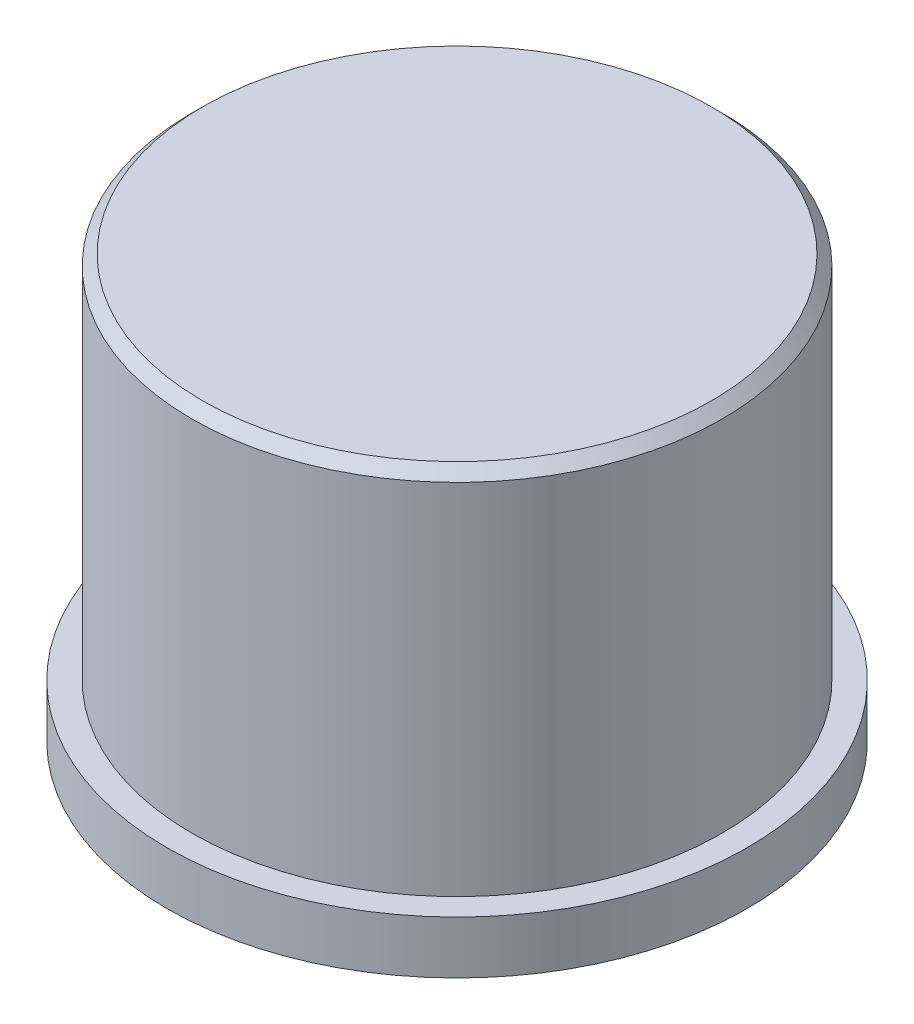
ISO-10303-21;
HEADER;
FILE_DESCRIPTION(('STEP AP214'),'2;1');
FILE_NAME('part.step','',(''),(''),'','','');
FILE_SCHEMA(('AUTOMOTIVE_DESIGN { 1 0 10303 214 1 1 1 1 }'));
ENDSEC;
DATA;
#1=APPLICATION_CONTEXT('core data for automotive mechanical design processes');
#2=APPLICATION_PROTOCOL_DEFINITION('international standard','automotive_design',2000,#1);
#3=PRODUCT_CONTEXT('',#1,'mechanical');
#4=PRODUCT('Part','Part','',(#3));
#5=PRODUCT_RELATED_PRODUCT_CATEGORY('part','',(#4));
#6=PRODUCT_DEFINITION_FORMATION('','',#4);
#7=PRODUCT_DEFINITION_CONTEXT('part definition',#1,'design');
#8=PRODUCT_DEFINITION('design','',#6,#7);
#9=PRODUCT_DEFINITION_SHAPE('','',#8);
#10=(LENGTH_UNIT() NAMED_UNIT(*) SI_UNIT(.MILLI.,.METRE.));
#11=(NAMED_UNIT(*) PLANE_ANGLE_UNIT() SI_UNIT($,.RADIAN.));
#12=(NAMED_UNIT(*) SI_UNIT($,.STERADIAN.) SOLID_ANGLE_UNIT());
#13=UNCERTAINTY_MEASURE_WITH_UNIT(LENGTH_MEASURE(1.E-05),#10,'distance_accuracy_value','');
#14=(GEOMETRIC_REPRESENTATION_CONTEXT(3) GLOBAL_UNCERTAINTY_ASSIGNED_CONTEXT((#13)) GLOBAL_UNIT_ASSIGNED_CONTEXT((#10,
#11,#12)) REPRESENTATION_CONTEXT('',''));
#15=CARTESIAN_POINT('',(0.,0.,0.));
#16=DIRECTION('',(0.,0.,1.));
#17=DIRECTION('',(1.,0.,0.));
#18=AXIS2_PLACEMENT_3D('',#15,#16,#17);
#19=CARTESIAN_POINT('',(0.,1.,0.));
#20=DIRECTION('',(0.,-1.,0.));
#21=DIRECTION('',(0.,0.,-1.));
#22=AXIS2_PLACEMENT_3D('',#19,#20,#21);
#23=CYLINDRICAL_SURFACE('',#22,5.5);
#24=CARTESIAN_POINT('',(0.,1.,0.));
#25=DIRECTION('',(0.,1.,0.));
#26=DIRECTION('',(0.,0.,1.));
#27=AXIS2_PLACEMENT_3D('',#24,#25,#26);
#28=CIRCLE('',#27,5.5);
#29=CARTESIAN_POINT('',(0.,1.,5.5));
#30=VERTEX_POINT('',#29);
#31=EDGE_CURVE('E155',#30,#30,#28,.T.);
#32=ORIENTED_EDGE('',*,*,#31,.F.);
#33=EDGE_LOOP('',(#32));
#34=FACE_BOUND('',#33,.T.);
#35=CARTESIAN_POINT('',(0.,0.,0.));
#36=DIRECTION('',(0.,1.,0.));
#37=DIRECTION('',(0.,0.,1.));
#38=AXIS2_PLACEMENT_3D('',#35,#36,#37);
#39=CIRCLE('',#38,5.5);
#40=CARTESIAN_POINT('',(0.,0.,5.5));
#41=VERTEX_POINT('',#40);
#42=EDGE_CURVE('E146',#41,#41,#39,.T.);
#43=ORIENTED_EDGE('',*,*,#42,.T.);
#44=EDGE_LOOP('',(#43));
#45=FACE_BOUND('',#44,.T.);
#46=ADVANCED_FACE('F43',(#34,#45),#23,.T.);
#47=CARTESIAN_POINT('',(0.,1.,0.));
#48=DIRECTION('',(0.,1.,0.));
#49=DIRECTION('',(0.,0.,1.));
#50=AXIS2_PLACEMENT_3D('',#47,#48,#49);
#51=PLANE('',#50);
#52=CARTESIAN_POINT('',(0.,1.,0.));
#53=DIRECTION('',(0.,1.,0.));
#54=DIRECTION('',(0.,0.,1.));
#55=AXIS2_PLACEMENT_3D('',#52,#53,#54);
#56=CIRCLE('',#55,5.025);
#57=CARTESIAN_POINT('',(0.,1.,5.025));
#58=VERTEX_POINT('',#57);
#59=EDGE_CURVE('E152',#58,#58,#56,.T.);
#60=ORIENTED_EDGE('',*,*,#59,.F.);
#61=EDGE_LOOP('',(#60));
#62=FACE_BOUND('',#61,.T.);
#63=ORIENTED_EDGE('',*,*,#31,.T.);
#64=EDGE_LOOP('',(#63));
#65=FACE_BOUND('',#64,.T.);
#66=ADVANCED_FACE('F174',(#62,#65),#51,.T.);
#67=CARTESIAN_POINT('',(0.,0.,0.));
#68=DIRECTION('',(0.,1.,0.));
#69=DIRECTION('',(0.,0.,1.));
#70=AXIS2_PLACEMENT_3D('',#67,#68,#69);
#71=PLANE('',#70);
#72=DIRECTION('',(-0.5,0.,0.866025403784439));
#73=VECTOR('',#72,1.);
#74=CARTESIAN_POINT('',(3.00222139978605,0.,0.));
#75=LINE('',#74,#73);
#76=CARTESIAN_POINT('',(3.00222139978605,0.,0.));
#77=VERTEX_POINT('',#76);
#78=CARTESIAN_POINT('',(1.50111069989303,0.,2.6));
#79=VERTEX_POINT('',#78);
#80=EDGE_CURVE('E133',#77,#79,#75,.T.);
#81=ORIENTED_EDGE('',*,*,#80,.F.);
#82=DIRECTION('',(0.499999999999999,0.,0.866025403784439));
#83=VECTOR('',#82,1.);
#84=CARTESIAN_POINT('',(1.50111069989303,0.,-2.6));
#85=LINE('',#84,#83);
#86=CARTESIAN_POINT('',(1.50111069989303,0.,-2.6));
#87=VERTEX_POINT('',#86);
#88=EDGE_CURVE('E59',#87,#77,#85,.T.);
#89=ORIENTED_EDGE('',*,*,#88,.F.);
#90=DIRECTION('',(1.,0.,0.));
#91=VECTOR('',#90,1.);
#92=CARTESIAN_POINT('',(-1.50111069989303,0.,-2.6));
#93=LINE('',#92,#91);
#94=CARTESIAN_POINT('',(-1.50111069989303,0.,-2.6));
#95=VERTEX_POINT('',#94);
#96=EDGE_CURVE('E142',#95,#87,#93,.T.);
#97=ORIENTED_EDGE('',*,*,#96,.F.);
#98=DIRECTION('',(0.5,0.,-0.866025403784438));
#99=VECTOR('',#98,1.);
#100=CARTESIAN_POINT('',(-3.00222139978605,0.,0.));
#101=LINE('',#100,#99);
#102=CARTESIAN_POINT('',(-3.00222139978605,0.,0.));
#103=VERTEX_POINT('',#102);
#104=EDGE_CURVE('E140',#103,#95,#101,.T.);
#105=ORIENTED_EDGE('',*,*,#104,.F.);
#106=DIRECTION('',(-0.5,0.,-0.866025403784439));
#107=VECTOR('',#106,1.);
#108=CARTESIAN_POINT('',(-1.50111069989303,0.,2.6));
#109=LINE('',#108,#107);
#110=CARTESIAN_POINT('',(-1.50111069989303,0.,2.6));
#111=VERTEX_POINT('',#110);
#112=EDGE_CURVE('E107',#111,#103,#109,.T.);
#113=ORIENTED_EDGE('',*,*,#112,.F.);
#114=DIRECTION('',(-1.,0.,0.));
#115=VECTOR('',#114,1.);
#116=CARTESIAN_POINT('',(1.50111069989303,0.,2.6));
#117=LINE('',#116,#115);
#118=EDGE_CURVE('E136',#79,#111,#117,.T.);
#119=ORIENTED_EDGE('',*,*,#118,.F.);
#120=EDGE_LOOP('',(#81,#89,#97,#105,#113,#119));
#121=FACE_BOUND('',#120,.T.);
#122=ORIENTED_EDGE('',*,*,#42,.F.);
#123=EDGE_LOOP('',(#122));
#124=FACE_BOUND('',#123,.T.);
#125=ADVANCED_FACE('F179',(#121,#124),#71,.F.);
#126=CARTESIAN_POINT('',(0.,8.,0.));
#127=DIRECTION('',(0.,-1.,0.));
#128=DIRECTION('',(0.,0.,-1.));
#129=AXIS2_PLACEMENT_3D('',#126,#127,#128);
#130=CYLINDRICAL_SURFACE('',#129,5.025);
#131=CARTESIAN_POINT('',(0.,7.8,0.));
#132=DIRECTION('',(0.,1.,0.));
#133=DIRECTION('',(0.,0.,1.));
#134=AXIS2_PLACEMENT_3D('',#131,#132,#133);
#135=CIRCLE('',#134,5.025);
#136=CARTESIAN_POINT('',(0.,7.8,5.025));
#137=VERTEX_POINT('',#136);
#138=EDGE_CURVE('E11',#137,#137,#135,.F.);
#139=ORIENTED_EDGE('',*,*,#138,.T.);
#140=EDGE_LOOP('',(#139));
#141=FACE_BOUND('',#140,.T.);
#142=ORIENTED_EDGE('',*,*,#59,.T.);
#143=EDGE_LOOP('',(#142));
#144=FACE_BOUND('',#143,.T.);
#145=ADVANCED_FACE('F186',(#141,#144),#130,.T.);
#146=CARTESIAN_POINT('',(0.,8.,0.));
#147=DIRECTION('',(0.,1.,0.));
#148=DIRECTION('',(0.,0.,1.));
#149=AXIS2_PLACEMENT_3D('',#146,#147,#148);
#150=PLANE('',#149);
#151=CARTESIAN_POINT('',(0.,8.,0.));
#152=DIRECTION('',(0.,1.,0.));
#153=DIRECTION('',(0.,0.,1.));
#154=AXIS2_PLACEMENT_3D('',#151,#152,#153);
#155=CIRCLE('',#154,4.825);
#156=CARTESIAN_POINT('',(0.,8.,4.825));
#157=VERTEX_POINT('',#156);
#158=EDGE_CURVE('E52',#157,#157,#155,.T.);
#159=ORIENTED_EDGE('',*,*,#158,.T.);
#160=EDGE_LOOP('',(#159));
#161=FACE_BOUND('',#160,.T.);
#162=ADVANCED_FACE('F162',(#161),#150,.T.);
#163=CARTESIAN_POINT('',(1.50111069989303,7.,-2.6));
#164=DIRECTION('',(0.866025403784439,0.,-0.499999999999999));
#165=DIRECTION('',(-0.499999999999999,0.,-0.866025403784439));
#166=AXIS2_PLACEMENT_3D('',#163,#164,#165);
#167=PLANE('',#166);
#168=ORIENTED_EDGE('',*,*,#88,.T.);
#169=DIRECTION('',(0.,-1.,0.));
#170=VECTOR('',#169,1.);
#171=CARTESIAN_POINT('',(3.00222139978605,7.,0.));
#172=LINE('',#171,#170);
#173=CARTESIAN_POINT('',(3.00222139978605,7.,0.));
#174=VERTEX_POINT('',#173);
#175=EDGE_CURVE('E89',#174,#77,#172,.T.);
#176=ORIENTED_EDGE('',*,*,#175,.F.);
#177=DIRECTION('',(0.499999999999999,0.,0.866025403784439));
#178=VECTOR('',#177,1.);
#179=CARTESIAN_POINT('',(1.50111069989303,7.,-2.6));
#180=LINE('',#179,#178);
#181=CARTESIAN_POINT('',(1.50111069989303,7.,-2.6));
#182=VERTEX_POINT('',#181);
#183=EDGE_CURVE('E144',#182,#174,#180,.T.);
#184=ORIENTED_EDGE('',*,*,#183,.F.);
#185=DIRECTION('',(0.,-1.,0.));
#186=VECTOR('',#185,1.);
#187=CARTESIAN_POINT('',(1.50111069989303,7.,-2.6));
#188=LINE('',#187,#186);
#189=EDGE_CURVE('E67',#182,#87,#188,.T.);
#190=ORIENTED_EDGE('',*,*,#189,.T.);
#191=EDGE_LOOP('',(#168,#176,#184,#190));
#192=FACE_BOUND('',#191,.T.);
#193=ADVANCED_FACE('F193',(#192),#167,.F.);
#194=CARTESIAN_POINT('',(-1.50111069989303,7.,-2.6));
#195=DIRECTION('',(0.,0.,-1.));
#196=DIRECTION('',(-1.,0.,0.));
#197=AXIS2_PLACEMENT_3D('',#194,#195,#196);
#198=PLANE('',#197);
#199=ORIENTED_EDGE('',*,*,#96,.T.);
#200=ORIENTED_EDGE('',*,*,#189,.F.);
#201=DIRECTION('',(1.,0.,0.));
#202=VECTOR('',#201,1.);
#203=CARTESIAN_POINT('',(-1.50111069989303,7.,-2.6));
#204=LINE('',#203,#202);
#205=CARTESIAN_POINT('',(-1.50111069989303,7.,-2.6));
#206=VERTEX_POINT('',#205);
#207=EDGE_CURVE('E119',#206,#182,#204,.T.);
#208=ORIENTED_EDGE('',*,*,#207,.F.);
#209=DIRECTION('',(0.,-1.,0.));
#210=VECTOR('',#209,1.);
#211=CARTESIAN_POINT('',(-1.50111069989303,7.,-2.6));
#212=LINE('',#211,#210);
#213=EDGE_CURVE('E111',#206,#95,#212,.T.);
#214=ORIENTED_EDGE('',*,*,#213,.T.);
#215=EDGE_LOOP('',(#199,#200,#208,#214));
#216=FACE_BOUND('',#215,.T.);
#217=ADVANCED_FACE('F196',(#216),#198,.F.);
#218=CARTESIAN_POINT('',(-3.00222139978605,7.,0.));
#219=DIRECTION('',(-0.866025403784438,0.,-0.5));
#220=DIRECTION('',(-0.5,0.,0.866025403784438));
#221=AXIS2_PLACEMENT_3D('',#218,#219,#220);
#222=PLANE('',#221);
#223=ORIENTED_EDGE('',*,*,#104,.T.);
#224=ORIENTED_EDGE('',*,*,#213,.F.);
#225=DIRECTION('',(0.5,0.,-0.866025403784438));
#226=VECTOR('',#225,1.);
#227=CARTESIAN_POINT('',(-3.00222139978605,7.,0.));
#228=LINE('',#227,#226);
#229=CARTESIAN_POINT('',(-3.00222139978605,7.,0.));
#230=VERTEX_POINT('',#229);
#231=EDGE_CURVE('E115',#230,#206,#228,.T.);
#232=ORIENTED_EDGE('',*,*,#231,.F.);
#233=DIRECTION('',(0.,-1.,0.));
#234=VECTOR('',#233,1.);
#235=CARTESIAN_POINT('',(-3.00222139978605,7.,0.));
#236=LINE('',#235,#234);
#237=EDGE_CURVE('E100',#230,#103,#236,.T.);
#238=ORIENTED_EDGE('',*,*,#237,.T.);
#239=EDGE_LOOP('',(#223,#224,#232,#238));
#240=FACE_BOUND('',#239,.T.);
#241=ADVANCED_FACE('F116',(#240),#222,.F.);
#242=CARTESIAN_POINT('',(-1.50111069989303,7.,2.6));
#243=DIRECTION('',(-0.866025403784439,0.,0.5));
#244=DIRECTION('',(0.5,0.,0.866025403784439));
#245=AXIS2_PLACEMENT_3D('',#242,#243,#244);
#246=PLANE('',#245);
#247=ORIENTED_EDGE('',*,*,#112,.T.);
#248=ORIENTED_EDGE('',*,*,#237,.F.);
#249=DIRECTION('',(-0.5,0.,-0.866025403784439));
#250=VECTOR('',#249,1.);
#251=CARTESIAN_POINT('',(-1.50111069989303,7.,2.6));
#252=LINE('',#251,#250);
#253=CARTESIAN_POINT('',(-1.50111069989303,7.,2.6));
#254=VERTEX_POINT('',#253);
#255=EDGE_CURVE('E104',#254,#230,#252,.T.);
#256=ORIENTED_EDGE('',*,*,#255,.F.);
#257=DIRECTION('',(0.,-1.,0.));
#258=VECTOR('',#257,1.);
#259=CARTESIAN_POINT('',(-1.50111069989303,7.,2.6));
#260=LINE('',#259,#258);
#261=EDGE_CURVE('E112',#254,#111,#260,.T.);
#262=ORIENTED_EDGE('',*,*,#261,.T.);
#263=EDGE_LOOP('',(#247,#248,#256,#262));
#264=FACE_BOUND('',#263,.T.);
#265=ADVANCED_FACE('F102',(#264),#246,.F.);
#266=CARTESIAN_POINT('',(1.50111069989303,7.,2.6));
#267=DIRECTION('',(0.,0.,1.));
#268=DIRECTION('',(1.,0.,0.));
#269=AXIS2_PLACEMENT_3D('',#266,#267,#268);
#270=PLANE('',#269);
#271=ORIENTED_EDGE('',*,*,#118,.T.);
#272=ORIENTED_EDGE('',*,*,#261,.F.);
#273=DIRECTION('',(-1.,0.,0.));
#274=VECTOR('',#273,1.);
#275=CARTESIAN_POINT('',(1.50111069989303,7.,2.6));
#276=LINE('',#275,#274);
#277=CARTESIAN_POINT('',(1.50111069989303,7.,2.6));
#278=VERTEX_POINT('',#277);
#279=EDGE_CURVE('E125',#278,#254,#276,.T.);
#280=ORIENTED_EDGE('',*,*,#279,.F.);
#281=DIRECTION('',(0.,-1.,0.));
#282=VECTOR('',#281,1.);
#283=CARTESIAN_POINT('',(1.50111069989303,7.,2.6));
#284=LINE('',#283,#282);
#285=EDGE_CURVE('E149',#278,#79,#284,.T.);
#286=ORIENTED_EDGE('',*,*,#285,.T.);
#287=EDGE_LOOP('',(#271,#272,#280,#286));
#288=FACE_BOUND('',#287,.T.);
#289=ADVANCED_FACE('F199',(#288),#270,.F.);
#290=CARTESIAN_POINT('',(3.00222139978605,7.,0.));
#291=DIRECTION('',(0.866025403784439,0.,0.5));
#292=DIRECTION('',(0.5,0.,-0.866025403784439));
#293=AXIS2_PLACEMENT_3D('',#290,#291,#292);
#294=PLANE('',#293);
#295=ORIENTED_EDGE('',*,*,#80,.T.);
#296=ORIENTED_EDGE('',*,*,#285,.F.);
#297=DIRECTION('',(-0.5,0.,0.866025403784439));
#298=VECTOR('',#297,1.);
#299=CARTESIAN_POINT('',(3.00222139978605,7.,0.));
#300=LINE('',#299,#298);
#301=EDGE_CURVE('E127',#174,#278,#300,.T.);
#302=ORIENTED_EDGE('',*,*,#301,.F.);
#303=ORIENTED_EDGE('',*,*,#175,.T.);
#304=EDGE_LOOP('',(#295,#296,#302,#303));
#305=FACE_BOUND('',#304,.T.);
#306=ADVANCED_FACE('F170',(#305),#294,.F.);
#307=CARTESIAN_POINT('',(0.,7.,0.));
#308=DIRECTION('',(0.,-1.,0.));
#309=DIRECTION('',(0.,0.,-1.));
#310=AXIS2_PLACEMENT_3D('',#307,#308,#309);
#311=PLANE('',#310);
#312=ORIENTED_EDGE('',*,*,#183,.T.);
#313=ORIENTED_EDGE('',*,*,#301,.T.);
#314=ORIENTED_EDGE('',*,*,#279,.T.);
#315=ORIENTED_EDGE('',*,*,#255,.T.);
#316=ORIENTED_EDGE('',*,*,#231,.T.);
#317=ORIENTED_EDGE('',*,*,#207,.T.);
#318=EDGE_LOOP('',(#312,#313,#314,#315,#316,#317));
#319=FACE_BOUND('',#318,.T.);
#320=ADVANCED_FACE('F122',(#319),#311,.T.);
#321=CARTESIAN_POINT('',(0.,8.,0.));
#322=DIRECTION('',(0.,-1.,0.));
#323=DIRECTION('',(0.,0.,-1.));
#324=AXIS2_PLACEMENT_3D('',#321,#322,#323);
#325=CONICAL_SURFACE('',#324,4.825,0.785398163397446);
#326=ORIENTED_EDGE('',*,*,#138,.F.);
#327=EDGE_LOOP('',(#326));
#328=FACE_BOUND('',#327,.T.);
#329=ORIENTED_EDGE('',*,*,#158,.F.);
#330=EDGE_LOOP('',(#329));
#331=FACE_BOUND('',#330,.T.);
#332=ADVANCED_FACE('F46',(#328,#331),#325,.T.);
#333=CLOSED_SHELL('',(#46,#66,#125,#145,#162,#193,#217,#241,#265,#289,#306,#320,#332));
#334=MANIFOLD_SOLID_BREP('B2',#333);
#335=ADVANCED_BREP_SHAPE_REPRESENTATION('',(#18,#334),#14);
#336=SHAPE_DEFINITION_REPRESENTATION(#9,#335);
ENDSEC;
END-ISO-10303-21;
